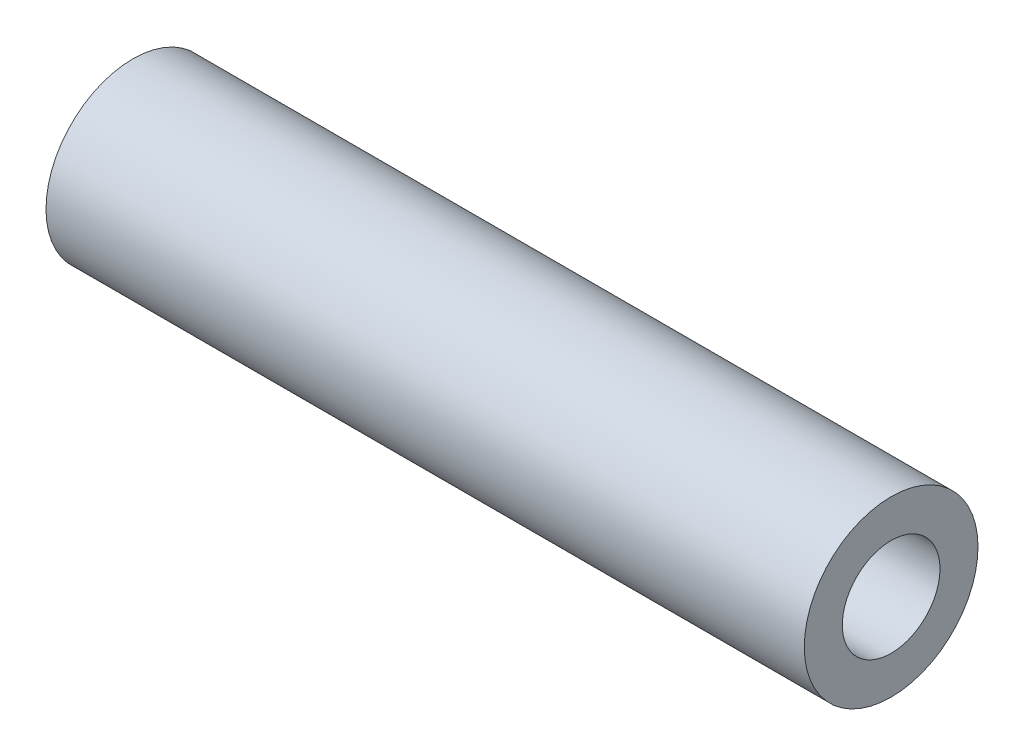
ISO-10303-21;
HEADER;
FILE_DESCRIPTION(('STEP AP214'),'2;1');
FILE_NAME('part.step','',(''),(''),'','','');
FILE_SCHEMA(('AUTOMOTIVE_DESIGN { 1 0 10303 214 1 1 1 1 }'));
ENDSEC;
DATA;
#1=APPLICATION_CONTEXT('core data for automotive mechanical design processes');
#2=APPLICATION_PROTOCOL_DEFINITION('international standard','automotive_design',2000,#1);
#3=PRODUCT_CONTEXT('',#1,'mechanical');
#4=PRODUCT('Part','Part','',(#3));
#5=PRODUCT_RELATED_PRODUCT_CATEGORY('part','',(#4));
#6=PRODUCT_DEFINITION_FORMATION('','',#4);
#7=PRODUCT_DEFINITION_CONTEXT('part definition',#1,'design');
#8=PRODUCT_DEFINITION('design','',#6,#7);
#9=PRODUCT_DEFINITION_SHAPE('','',#8);
#10=(LENGTH_UNIT() NAMED_UNIT(*) SI_UNIT(.MILLI.,.METRE.));
#11=(NAMED_UNIT(*) PLANE_ANGLE_UNIT() SI_UNIT($,.RADIAN.));
#12=(NAMED_UNIT(*) SI_UNIT($,.STERADIAN.) SOLID_ANGLE_UNIT());
#13=UNCERTAINTY_MEASURE_WITH_UNIT(LENGTH_MEASURE(1.E-05),#10,'distance_accuracy_value','');
#14=(GEOMETRIC_REPRESENTATION_CONTEXT(3) GLOBAL_UNCERTAINTY_ASSIGNED_CONTEXT((#13)) GLOBAL_UNIT_ASSIGNED_CONTEXT((#10,
#11,#12)) REPRESENTATION_CONTEXT('',''));
#15=CARTESIAN_POINT('',(0.,0.,0.));
#16=DIRECTION('',(0.,0.,1.));
#17=DIRECTION('',(1.,0.,0.));
#18=AXIS2_PLACEMENT_3D('',#15,#16,#17);
#19=CARTESIAN_POINT('',(34.925,0.,0.));
#20=DIRECTION('',(1.,0.,0.));
#21=DIRECTION('',(0.,0.,-1.));
#22=AXIS2_PLACEMENT_3D('',#19,#20,#21);
#23=PLANE('',#22);
#24=CARTESIAN_POINT('',(34.925,0.,0.));
#25=DIRECTION('',(1.,0.,0.));
#26=DIRECTION('',(0.,0.,-1.));
#27=AXIS2_PLACEMENT_3D('',#24,#25,#26);
#28=CIRCLE('',#27,4.);
#29=CARTESIAN_POINT('',(34.925,0.,-4.));
#30=VERTEX_POINT('',#29);
#31=EDGE_CURVE('E10',#30,#30,#28,.T.);
#32=ORIENTED_EDGE('',*,*,#31,.T.);
#33=EDGE_LOOP('',(#32));
#34=FACE_BOUND('',#33,.T.);
#35=CARTESIAN_POINT('',(34.925,0.,0.));
#36=DIRECTION('',(1.,0.,0.));
#37=DIRECTION('',(0.,0.,-1.));
#38=AXIS2_PLACEMENT_3D('',#35,#36,#37);
#39=CIRCLE('',#38,2.25);
#40=CARTESIAN_POINT('',(34.925,0.,-2.25));
#41=VERTEX_POINT('',#40);
#42=EDGE_CURVE('E50',#41,#41,#39,.T.);
#43=ORIENTED_EDGE('',*,*,#42,.F.);
#44=EDGE_LOOP('',(#43));
#45=FACE_BOUND('',#44,.T.);
#46=ADVANCED_FACE('F37',(#34,#45),#23,.T.);
#47=CARTESIAN_POINT('',(0.,0.,0.));
#48=DIRECTION('',(1.,0.,0.));
#49=DIRECTION('',(0.,0.,-1.));
#50=AXIS2_PLACEMENT_3D('',#47,#48,#49);
#51=PLANE('',#50);
#52=CARTESIAN_POINT('',(0.,0.,0.));
#53=DIRECTION('',(1.,0.,0.));
#54=DIRECTION('',(0.,0.,-1.));
#55=AXIS2_PLACEMENT_3D('',#52,#53,#54);
#56=CIRCLE('',#55,4.);
#57=CARTESIAN_POINT('',(0.,0.,-4.));
#58=VERTEX_POINT('',#57);
#59=EDGE_CURVE('E41',#58,#58,#56,.T.);
#60=ORIENTED_EDGE('',*,*,#59,.F.);
#61=EDGE_LOOP('',(#60));
#62=FACE_BOUND('',#61,.T.);
#63=CARTESIAN_POINT('',(0.,0.,0.));
#64=DIRECTION('',(1.,0.,0.));
#65=DIRECTION('',(0.,0.,-1.));
#66=AXIS2_PLACEMENT_3D('',#63,#64,#65);
#67=CIRCLE('',#66,2.25);
#68=CARTESIAN_POINT('',(0.,0.,-2.25));
#69=VERTEX_POINT('',#68);
#70=EDGE_CURVE('E52',#69,#69,#67,.T.);
#71=ORIENTED_EDGE('',*,*,#70,.T.);
#72=EDGE_LOOP('',(#71));
#73=FACE_BOUND('',#72,.T.);
#74=ADVANCED_FACE('F64',(#62,#73),#51,.F.);
#75=CARTESIAN_POINT('',(34.925,0.,0.));
#76=DIRECTION('',(-1.,0.,0.));
#77=DIRECTION('',(0.,0.,1.));
#78=AXIS2_PLACEMENT_3D('',#75,#76,#77);
#79=CYLINDRICAL_SURFACE('',#78,4.);
#80=ORIENTED_EDGE('',*,*,#31,.F.);
#81=EDGE_LOOP('',(#80));
#82=FACE_BOUND('',#81,.T.);
#83=ORIENTED_EDGE('',*,*,#59,.T.);
#84=EDGE_LOOP('',(#83));
#85=FACE_BOUND('',#84,.T.);
#86=ADVANCED_FACE('F39',(#82,#85),#79,.T.);
#87=CARTESIAN_POINT('',(34.925,0.,0.));
#88=DIRECTION('',(-1.,0.,0.));
#89=DIRECTION('',(0.,0.,1.));
#90=AXIS2_PLACEMENT_3D('',#87,#88,#89);
#91=CYLINDRICAL_SURFACE('',#90,2.25);
#92=ORIENTED_EDGE('',*,*,#42,.T.);
#93=EDGE_LOOP('',(#92));
#94=FACE_BOUND('',#93,.T.);
#95=ORIENTED_EDGE('',*,*,#70,.F.);
#96=EDGE_LOOP('',(#95));
#97=FACE_BOUND('',#96,.T.);
#98=ADVANCED_FACE('F60',(#94,#97),#91,.F.);
#99=CLOSED_SHELL('',(#46,#74,#86,#98));
#100=MANIFOLD_SOLID_BREP('B2',#99);
#101=ADVANCED_BREP_SHAPE_REPRESENTATION('',(#18,#100),#14);
#102=SHAPE_DEFINITION_REPRESENTATION(#9,#101);
ENDSEC;
END-ISO-10303-21;
